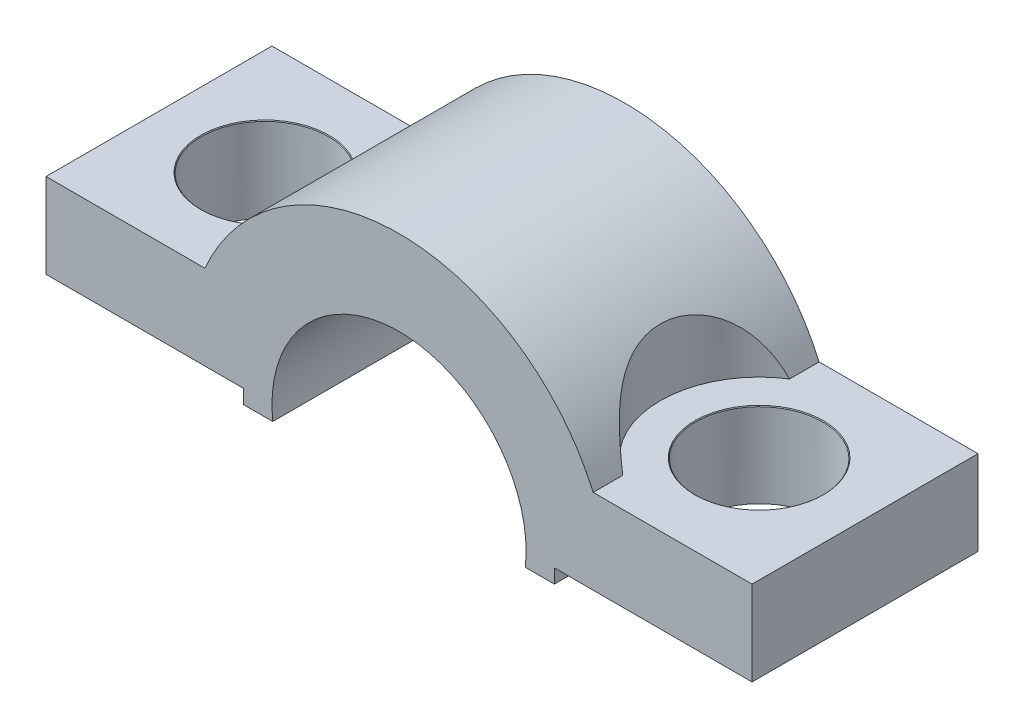
ISO-10303-21;
HEADER;
FILE_DESCRIPTION(('STEP AP214'),'2;1');
FILE_NAME('part.step','',(''),(''),'','','');
FILE_SCHEMA(('AUTOMOTIVE_DESIGN { 1 0 10303 214 1 1 1 1 }'));
ENDSEC;
DATA;
#1=APPLICATION_CONTEXT('core data for automotive mechanical design processes');
#2=APPLICATION_PROTOCOL_DEFINITION('international standard','automotive_design',2000,#1);
#3=PRODUCT_CONTEXT('',#1,'mechanical');
#4=PRODUCT('Part','Part','',(#3));
#5=PRODUCT_RELATED_PRODUCT_CATEGORY('part','',(#4));
#6=PRODUCT_DEFINITION_FORMATION('','',#4);
#7=PRODUCT_DEFINITION_CONTEXT('part definition',#1,'design');
#8=PRODUCT_DEFINITION('design','',#6,#7);
#9=PRODUCT_DEFINITION_SHAPE('','',#8);
#10=(LENGTH_UNIT() NAMED_UNIT(*) SI_UNIT(.MILLI.,.METRE.));
#11=(NAMED_UNIT(*) PLANE_ANGLE_UNIT() SI_UNIT($,.RADIAN.));
#12=(NAMED_UNIT(*) SI_UNIT($,.STERADIAN.) SOLID_ANGLE_UNIT());
#13=UNCERTAINTY_MEASURE_WITH_UNIT(LENGTH_MEASURE(1.E-05),#10,'distance_accuracy_value','');
#14=(GEOMETRIC_REPRESENTATION_CONTEXT(3) GLOBAL_UNCERTAINTY_ASSIGNED_CONTEXT((#13)) GLOBAL_UNIT_ASSIGNED_CONTEXT((#10,
#11,#12)) REPRESENTATION_CONTEXT('',''));
#15=CARTESIAN_POINT('',(0.,0.,0.));
#16=DIRECTION('',(0.,0.,1.));
#17=DIRECTION('',(1.,0.,0.));
#18=AXIS2_PLACEMENT_3D('',#15,#16,#17);
#19=CARTESIAN_POINT('',(0.,0.,8.));
#20=DIRECTION('',(0.,0.,-1.));
#21=DIRECTION('',(-1.,0.,0.));
#22=AXIS2_PLACEMENT_3D('',#19,#20,#21);
#23=CYLINDRICAL_SURFACE('',#22,7.5);
#24=DIRECTION('',(0.,0.,-1.));
#25=VECTOR('',#24,1.);
#26=CARTESIAN_POINT('',(6.87386354243376,3.,8.));
#27=LINE('',#26,#25);
#28=CARTESIAN_POINT('',(6.87386354243376,3.,8.));
#29=VERTEX_POINT('',#28);
#30=CARTESIAN_POINT('',(6.87386354243376,3.,6.95467629235265));
#31=VERTEX_POINT('',#30);
#32=EDGE_CURVE('E190',#29,#31,#27,.T.);
#33=ORIENTED_EDGE('',*,*,#32,.T.);
#34=CARTESIAN_POINT('',(6.87386354243376,3.,6.95467629235265));
#35=CARTESIAN_POINT('',(6.82725321535716,3.10686067237577,6.92505038627435));
#36=CARTESIAN_POINT('',(6.77838105926723,3.21198311139782,6.89249671722079));
#37=CARTESIAN_POINT('',(6.67675486093297,3.41819916637454,6.82056505245846));
#38=CARTESIAN_POINT('',(6.62399341148504,3.51928449829662,6.78117383070843));
#39=CARTESIAN_POINT('',(6.51495380665502,3.71729391693365,6.6943369873779));
#40=CARTESIAN_POINT('',(6.45864941165105,3.81417497055057,6.64682529901511));
#41=CARTESIAN_POINT('',(6.34408765908655,4.00182934661818,6.54313818713776));
#42=CARTESIAN_POINT('',(6.2858320030021,4.09260779290067,6.486970165446));
#43=CARTESIAN_POINT('',(6.14102854897093,4.30831628309082,6.33639427096159));
#44=CARTESIAN_POINT('',(6.05407564069189,4.42919915319211,6.23643414070272));
#45=CARTESIAN_POINT('',(5.88458599666926,4.65200992833673,6.01462649249154));
#46=CARTESIAN_POINT('',(5.80203528971963,4.75400069986742,5.89285431948707));
#47=CARTESIAN_POINT('',(5.68604335660596,4.89107261035333,5.69357490507859));
#48=CARTESIAN_POINT('',(5.64849608379264,4.93430861741121,5.62393794675249));
#49=CARTESIAN_POINT('',(5.5770887847886,5.01487448343902,5.47956245975678));
#50=CARTESIAN_POINT('',(5.54322686858753,5.05220737427364,5.40482657833545));
#51=CARTESIAN_POINT('',(5.48002846723094,5.12069004036265,5.25069193217783));
#52=CARTESIAN_POINT('',(5.45069439512257,5.15183652118027,5.17129071202518));
#53=CARTESIAN_POINT('',(5.39736004482914,5.20768638630462,5.00853044302546));
#54=CARTESIAN_POINT('',(5.37335882077416,5.23239091333491,4.92517209922884));
#55=CARTESIAN_POINT('',(5.33437233503921,5.27210870754067,4.76753013721272));
#56=CARTESIAN_POINT('',(5.31858697211988,5.28800462121963,4.69366468608141));
#57=CARTESIAN_POINT('',(5.2917278852645,5.31488265674953,4.5441715857556));
#58=CARTESIAN_POINT('',(5.280655760948,5.32586311041444,4.46854334746168));
#59=CARTESIAN_POINT('',(5.26347512551859,5.34284364750111,4.3162399908324));
#60=CARTESIAN_POINT('',(5.25736190785499,5.34884845347931,4.23956593555514));
#61=CARTESIAN_POINT('',(5.25020134522296,5.3558754793867,4.08574676069184));
#62=CARTESIAN_POINT('',(5.24915579617626,5.35689593292142,4.00860148380655));
#63=CARTESIAN_POINT('',(5.25345463812275,5.35269014975468,3.78976537880927));
#64=CARTESIAN_POINT('',(5.26489490616874,5.34150585901739,3.6482149217585));
#65=CARTESIAN_POINT('',(5.30430635911783,5.30236489485648,3.36993535206473));
#66=CARTESIAN_POINT('',(5.33227460729994,5.27441120103696,3.23320538748031));
#67=CARTESIAN_POINT('',(5.4027993291797,5.20214298177105,2.96796850693995));
#68=CARTESIAN_POINT('',(5.44536910811923,5.1578135315222,2.83946921814142));
#69=CARTESIAN_POINT('',(5.54221244249114,5.05360417920766,2.59374174788709));
#70=CARTESIAN_POINT('',(5.59648728196031,4.99372257093398,2.47651480504116));
#71=CARTESIAN_POINT('',(5.71725990036631,4.85509244041146,2.24776421228563));
#72=CARTESIAN_POINT('',(5.78433432702579,4.7753456808255,2.13715478283668));
#73=CARTESIAN_POINT('',(5.92370771772636,4.60131425092226,1.93178644231409));
#74=CARTESIAN_POINT('',(5.99601014593523,4.50701989332296,1.83703818153927));
#75=CARTESIAN_POINT('',(6.12225065078074,4.33316383741803,1.68660052914249));
#76=CARTESIAN_POINT('',(6.17588858789133,4.25647678739561,1.62726519046118));
#77=CARTESIAN_POINT('',(6.28265535420684,4.09724590584679,1.51642748621912));
#78=CARTESIAN_POINT('',(6.33578393458142,4.01469936235203,1.4649287828379));
#79=CARTESIAN_POINT('',(6.4405137994691,3.84444920757389,1.36916017269573));
#80=CARTESIAN_POINT('',(6.49211302349275,3.75673907549444,1.324899685037));
#81=CARTESIAN_POINT('',(6.5928596577692,3.57698371259997,1.24301657338099));
#82=CARTESIAN_POINT('',(6.64200795930431,3.48494008169388,1.20539152358208));
#83=CARTESIAN_POINT('',(6.72189916699377,3.3273377167529,1.14721136502048));
#84=CARTESIAN_POINT('',(6.75347796760898,3.26278129741034,1.12505801479295));
#85=CARTESIAN_POINT('',(6.81494045554786,3.13237479905454,1.08333889300346));
#86=CARTESIAN_POINT('',(6.8448302233025,3.06653068507293,1.06376345046689));
#87=CARTESIAN_POINT('',(6.87386354243376,3.,1.04532370764735));
#88=B_SPLINE_CURVE_WITH_KNOTS('',3,(#34,#35,#36,#37,#38,#39,#40,#41,#42,#43,#44,#45,#46,#47,#48,
#49,#50,#51,#52,#53,#54,#55,#56,#57,#58,#59,#60,#61,#62,#63,#64,#65,#66,#67,#68,#69,#70,#71,#72,
#73,#74,#75,#76,#77,#78,#79,#80,#81,#82,#83,#84,#85,#86,#87),.UNSPECIFIED.,.F.,.F.,(4,2,2,2,2,2,
2,2,2,2,2,2,2,2,2,2,2,2,2,2,2,2,2,2,2,2,4),(0.,0.360877312459293,0.722460619845825,
1.08713944566849,1.45150815600247,1.98745333890859,2.52158171629287,2.79170769579841,
3.06169448366291,3.33182466384087,3.60190689359255,3.8331623205748,4.06449617056346,
4.29561020140701,4.52680613034026,4.95193948851722,5.37699733094321,5.80244352911322,
6.22793642218932,6.68205377516062,7.13647484173996,7.46847379650935,7.80062742613474,
8.13320990642631,8.46567054711131,8.6912108152637,8.91587928489277),.UNSPECIFIED.);
#89=CARTESIAN_POINT('',(6.87386354243376,3.,1.04532370764735));
#90=VERTEX_POINT('',#89);
#91=EDGE_CURVE('E301',#31,#90,#88,.T.);
#92=ORIENTED_EDGE('',*,*,#91,.T.);
#93=CARTESIAN_POINT('',(6.87386354243376,3.,0.));
#94=VERTEX_POINT('',#93);
#95=EDGE_CURVE('E189',#90,#94,#27,.T.);
#96=ORIENTED_EDGE('',*,*,#95,.T.);
#97=CARTESIAN_POINT('',(0.,0.,0.));
#98=DIRECTION('',(0.,0.,1.));
#99=DIRECTION('',(1.,0.,0.));
#100=AXIS2_PLACEMENT_3D('',#97,#98,#99);
#101=CIRCLE('',#100,7.5);
#102=CARTESIAN_POINT('',(-6.87386354243376,3.,0.));
#103=VERTEX_POINT('',#102);
#104=EDGE_CURVE('E170',#94,#103,#101,.T.);
#105=ORIENTED_EDGE('',*,*,#104,.T.);
#106=DIRECTION('',(0.,0.,-1.));
#107=VECTOR('',#106,1.);
#108=CARTESIAN_POINT('',(-6.87386354243376,3.,8.));
#109=LINE('',#108,#107);
#110=CARTESIAN_POINT('',(-6.87386354243376,3.,1.04532370764735));
#111=VERTEX_POINT('',#110);
#112=EDGE_CURVE('E185',#111,#103,#109,.T.);
#113=ORIENTED_EDGE('',*,*,#112,.F.);
#114=CARTESIAN_POINT('',(-6.87386354243376,3.,6.95467629235265));
#115=CARTESIAN_POINT('',(-6.82725321535716,3.10686067237577,6.92505038627435));
#116=CARTESIAN_POINT('',(-6.77838105926723,3.21198311139782,6.89249671722079));
#117=CARTESIAN_POINT('',(-6.67675486093297,3.41819916637454,6.82056505245846));
#118=CARTESIAN_POINT('',(-6.62399341148504,3.51928449829662,6.78117383070843));
#119=CARTESIAN_POINT('',(-6.51495380665502,3.71729391693365,6.6943369873779));
#120=CARTESIAN_POINT('',(-6.45864941165105,3.81417497055057,6.64682529901511));
#121=CARTESIAN_POINT('',(-6.34408765908655,4.00182934661818,6.54313818713776));
#122=CARTESIAN_POINT('',(-6.2858320030021,4.09260779290067,6.486970165446));
#123=CARTESIAN_POINT('',(-6.14102854897093,4.30831628309082,6.33639427096159));
#124=CARTESIAN_POINT('',(-6.05407564069189,4.42919915319211,6.23643414070272));
#125=CARTESIAN_POINT('',(-5.88458599666926,4.65200992833673,6.01462649249154));
#126=CARTESIAN_POINT('',(-5.80203528971963,4.75400069986742,5.89285431948707));
#127=CARTESIAN_POINT('',(-5.68604335660596,4.89107261035333,5.69357490507859));
#128=CARTESIAN_POINT('',(-5.64849608379264,4.93430861741121,5.62393794675249));
#129=CARTESIAN_POINT('',(-5.5770887847886,5.01487448343902,5.47956245975678));
#130=CARTESIAN_POINT('',(-5.54322686858753,5.05220737427364,5.40482657833545));
#131=CARTESIAN_POINT('',(-5.48002846723094,5.12069004036265,5.25069193217783));
#132=CARTESIAN_POINT('',(-5.45069439512257,5.15183652118027,5.17129071202518));
#133=CARTESIAN_POINT('',(-5.39736004482914,5.20768638630462,5.00853044302546));
#134=CARTESIAN_POINT('',(-5.37335882077416,5.23239091333491,4.92517209922884));
#135=CARTESIAN_POINT('',(-5.33437233503921,5.27210870754067,4.76753013721272));
#136=CARTESIAN_POINT('',(-5.31858697211988,5.28800462121963,4.69366468608141));
#137=CARTESIAN_POINT('',(-5.2917278852645,5.31488265674953,4.5441715857556));
#138=CARTESIAN_POINT('',(-5.280655760948,5.32586311041444,4.46854334746168));
#139=CARTESIAN_POINT('',(-5.26347512551859,5.34284364750111,4.3162399908324));
#140=CARTESIAN_POINT('',(-5.25736190785499,5.34884845347931,4.23956593555514));
#141=CARTESIAN_POINT('',(-5.25020134522296,5.3558754793867,4.08574676069184));
#142=CARTESIAN_POINT('',(-5.24915579617626,5.35689593292142,4.00860148380655));
#143=CARTESIAN_POINT('',(-5.25345463812275,5.35269014975468,3.78976537880927));
#144=CARTESIAN_POINT('',(-5.26489490616874,5.34150585901739,3.6482149217585));
#145=CARTESIAN_POINT('',(-5.30430635911783,5.30236489485648,3.36993535206473));
#146=CARTESIAN_POINT('',(-5.33227460729994,5.27441120103696,3.23320538748031));
#147=CARTESIAN_POINT('',(-5.4027993291797,5.20214298177105,2.96796850693995));
#148=CARTESIAN_POINT('',(-5.44536910811923,5.1578135315222,2.83946921814142));
#149=CARTESIAN_POINT('',(-5.54221244249114,5.05360417920766,2.59374174788709));
#150=CARTESIAN_POINT('',(-5.59648728196031,4.99372257093398,2.47651480504116));
#151=CARTESIAN_POINT('',(-5.71725990036631,4.85509244041146,2.24776421228563));
#152=CARTESIAN_POINT('',(-5.78433432702579,4.7753456808255,2.13715478283668));
#153=CARTESIAN_POINT('',(-5.92370771772636,4.60131425092226,1.93178644231409));
#154=CARTESIAN_POINT('',(-5.99601014593523,4.50701989332296,1.83703818153927));
#155=CARTESIAN_POINT('',(-6.12225065078074,4.33316383741803,1.68660052914249));
#156=CARTESIAN_POINT('',(-6.17588858789133,4.25647678739561,1.62726519046118));
#157=CARTESIAN_POINT('',(-6.28265535420684,4.09724590584679,1.51642748621912));
#158=CARTESIAN_POINT('',(-6.33578393458142,4.01469936235203,1.4649287828379));
#159=CARTESIAN_POINT('',(-6.4405137994691,3.84444920757389,1.36916017269573));
#160=CARTESIAN_POINT('',(-6.49211302349275,3.75673907549444,1.324899685037));
#161=CARTESIAN_POINT('',(-6.5928596577692,3.57698371259997,1.24301657338099));
#162=CARTESIAN_POINT('',(-6.64200795930431,3.48494008169388,1.20539152358208));
#163=CARTESIAN_POINT('',(-6.72189916699377,3.3273377167529,1.14721136502048));
#164=CARTESIAN_POINT('',(-6.75347796760898,3.26278129741034,1.12505801479295));
#165=CARTESIAN_POINT('',(-6.81494045554786,3.13237479905454,1.08333889300346));
#166=CARTESIAN_POINT('',(-6.8448302233025,3.06653068507293,1.06376345046689));
#167=CARTESIAN_POINT('',(-6.87386354243376,3.,1.04532370764735));
#168=B_SPLINE_CURVE_WITH_KNOTS('',3,(#114,#115,#116,#117,#118,#119,#120,#121,#122,#123,#124,
#125,#126,#127,#128,#129,#130,#131,#132,#133,#134,#135,#136,#137,#138,#139,#140,#141,#142,#143,
#144,#145,#146,#147,#148,#149,#150,#151,#152,#153,#154,#155,#156,#157,#158,#159,#160,#161,#162,
#163,#164,#165,#166,#167),.UNSPECIFIED.,.F.,.F.,(4,2,2,2,2,2,2,2,2,2,2,2,2,2,2,2,2,2,2,2,2,2,2,
2,2,2,4),(0.,0.360877312459293,0.722460619845825,1.08713944566849,1.45150815600247,
1.98745333890859,2.52158171629287,2.79170769579841,3.06169448366291,3.33182466384087,
3.60190689359255,3.8331623205748,4.06449617056346,4.29561020140701,4.52680613034026,
4.95193948851722,5.37699733094321,5.80244352911322,6.22793642218932,6.68205377516062,
7.13647484173996,7.46847379650935,7.80062742613474,8.13320990642631,8.46567054711131,
8.6912108152637,8.91587928489277),.UNSPECIFIED.);
#169=CARTESIAN_POINT('',(-6.87386354243376,3.,6.95467629235265));
#170=VERTEX_POINT('',#169);
#171=EDGE_CURVE('E245',#170,#111,#168,.T.);
#172=ORIENTED_EDGE('',*,*,#171,.F.);
#173=CARTESIAN_POINT('',(-6.87386354243376,3.,8.));
#174=VERTEX_POINT('',#173);
#175=EDGE_CURVE('E186',#174,#170,#109,.T.);
#176=ORIENTED_EDGE('',*,*,#175,.F.);
#177=CARTESIAN_POINT('',(0.,0.,8.));
#178=DIRECTION('',(0.,0.,1.));
#179=DIRECTION('',(1.,0.,0.));
#180=AXIS2_PLACEMENT_3D('',#177,#178,#179);
#181=CIRCLE('',#180,7.5);
#182=EDGE_CURVE('E235',#29,#174,#181,.T.);
#183=ORIENTED_EDGE('',*,*,#182,.F.);
#184=EDGE_LOOP('',(#33,#92,#96,#105,#113,#172,#176,#183));
#185=FACE_BOUND('',#184,.T.);
#186=ADVANCED_FACE('F36',(#185),#23,.T.);
#187=CARTESIAN_POINT('',(4.0089400095287,-0.500000000000002,8.));
#188=DIRECTION('',(0.,1.,0.));
#189=DIRECTION('',(0.,0.,1.));
#190=AXIS2_PLACEMENT_3D('',#187,#188,#189);
#191=PLANE('',#190);
#192=DIRECTION('',(1.,0.,0.));
#193=VECTOR('',#192,1.);
#194=CARTESIAN_POINT('',(4.0089400095287,-0.500000000000002,8.));
#195=LINE('',#194,#193);
#196=CARTESIAN_POINT('',(4.47213595499958,-0.500000000000002,8.));
#197=VERTEX_POINT('',#196);
#198=CARTESIAN_POINT('',(5.5,-0.500000000000002,8.));
#199=VERTEX_POINT('',#198);
#200=EDGE_CURVE('E106',#197,#199,#195,.T.);
#201=ORIENTED_EDGE('',*,*,#200,.F.);
#202=DIRECTION('',(0.,0.,-1.));
#203=VECTOR('',#202,1.);
#204=CARTESIAN_POINT('',(4.47213595499958,-0.500000000000002,1.));
#205=LINE('',#204,#203);
#206=CARTESIAN_POINT('',(4.47213595499958,-0.500000000000002,0.));
#207=VERTEX_POINT('',#206);
#208=EDGE_CURVE('E220',#197,#207,#205,.T.);
#209=ORIENTED_EDGE('',*,*,#208,.T.);
#210=DIRECTION('',(1.,0.,0.));
#211=VECTOR('',#210,1.);
#212=CARTESIAN_POINT('',(4.0089400095287,-0.500000000000002,0.));
#213=LINE('',#212,#211);
#214=CARTESIAN_POINT('',(5.5,-0.500000000000002,0.));
#215=VERTEX_POINT('',#214);
#216=EDGE_CURVE('E158',#207,#215,#213,.T.);
#217=ORIENTED_EDGE('',*,*,#216,.T.);
#218=DIRECTION('',(0.,0.,-1.));
#219=VECTOR('',#218,1.);
#220=CARTESIAN_POINT('',(5.5,-0.500000000000002,8.));
#221=LINE('',#220,#219);
#222=EDGE_CURVE('E44',#199,#215,#221,.T.);
#223=ORIENTED_EDGE('',*,*,#222,.F.);
#224=EDGE_LOOP('',(#201,#209,#217,#223));
#225=FACE_BOUND('',#224,.T.);
#226=ADVANCED_FACE('F38',(#225),#191,.F.);
#227=CARTESIAN_POINT('',(5.5,0.,8.));
#228=DIRECTION('',(-1.,0.,0.));
#229=DIRECTION('',(0.,-1.,0.));
#230=AXIS2_PLACEMENT_3D('',#227,#228,#229);
#231=PLANE('',#230);
#232=DIRECTION('',(0.,1.,0.));
#233=VECTOR('',#232,1.);
#234=CARTESIAN_POINT('',(5.5,0.,0.));
#235=LINE('',#234,#233);
#236=CARTESIAN_POINT('',(5.5,0.,0.));
#237=VERTEX_POINT('',#236);
#238=EDGE_CURVE('E160',#215,#237,#235,.T.);
#239=ORIENTED_EDGE('',*,*,#238,.T.);
#240=DIRECTION('',(0.,0.,-1.));
#241=VECTOR('',#240,1.);
#242=CARTESIAN_POINT('',(5.5,0.,8.));
#243=LINE('',#242,#241);
#244=CARTESIAN_POINT('',(5.5,0.,8.));
#245=VERTEX_POINT('',#244);
#246=EDGE_CURVE('E199',#245,#237,#243,.T.);
#247=ORIENTED_EDGE('',*,*,#246,.F.);
#248=DIRECTION('',(0.,1.,0.));
#249=VECTOR('',#248,1.);
#250=CARTESIAN_POINT('',(5.5,0.,8.));
#251=LINE('',#250,#249);
#252=EDGE_CURVE('E227',#199,#245,#251,.T.);
#253=ORIENTED_EDGE('',*,*,#252,.F.);
#254=ORIENTED_EDGE('',*,*,#222,.T.);
#255=EDGE_LOOP('',(#239,#247,#253,#254));
#256=FACE_BOUND('',#255,.T.);
#257=ADVANCED_FACE('F284',(#256),#231,.F.);
#258=CARTESIAN_POINT('',(5.5,0.,8.));
#259=DIRECTION('',(0.,1.,0.));
#260=DIRECTION('',(-1.,0.,0.));
#261=AXIS2_PLACEMENT_3D('',#258,#259,#260);
#262=PLANE('',#261);
#263=CARTESIAN_POINT('',(8.75,0.,4.));
#264=DIRECTION('',(0.,1.,0.));
#265=DIRECTION('',(-1.,0.,0.));
#266=AXIS2_PLACEMENT_3D('',#263,#264,#265);
#267=CIRCLE('',#266,2.25);
#268=CARTESIAN_POINT('',(6.5,0.,4.));
#269=VERTEX_POINT('',#268);
#270=EDGE_CURVE('E161',#269,#269,#267,.T.);
#271=ORIENTED_EDGE('',*,*,#270,.T.);
#272=EDGE_LOOP('',(#271));
#273=FACE_BOUND('',#272,.T.);
#274=DIRECTION('',(1.,0.,0.));
#275=VECTOR('',#274,1.);
#276=CARTESIAN_POINT('',(5.5,0.,0.));
#277=LINE('',#276,#275);
#278=CARTESIAN_POINT('',(12.5,0.,0.));
#279=VERTEX_POINT('',#278);
#280=EDGE_CURVE('E163',#237,#279,#277,.T.);
#281=ORIENTED_EDGE('',*,*,#280,.T.);
#282=DIRECTION('',(0.,0.,-1.));
#283=VECTOR('',#282,1.);
#284=CARTESIAN_POINT('',(12.5,0.,8.));
#285=LINE('',#284,#283);
#286=CARTESIAN_POINT('',(12.5,0.,8.));
#287=VERTEX_POINT('',#286);
#288=EDGE_CURVE('E196',#287,#279,#285,.T.);
#289=ORIENTED_EDGE('',*,*,#288,.F.);
#290=DIRECTION('',(1.,0.,0.));
#291=VECTOR('',#290,1.);
#292=CARTESIAN_POINT('',(5.5,0.,8.));
#293=LINE('',#292,#291);
#294=EDGE_CURVE('E229',#245,#287,#293,.T.);
#295=ORIENTED_EDGE('',*,*,#294,.F.);
#296=ORIENTED_EDGE('',*,*,#246,.T.);
#297=EDGE_LOOP('',(#281,#289,#295,#296));
#298=FACE_BOUND('',#297,.T.);
#299=ADVANCED_FACE('F288',(#273,#298),#262,.F.);
#300=CARTESIAN_POINT('',(12.5,0.,8.));
#301=DIRECTION('',(-1.,0.,0.));
#302=DIRECTION('',(0.,0.,1.));
#303=AXIS2_PLACEMENT_3D('',#300,#301,#302);
#304=PLANE('',#303);
#305=DIRECTION('',(0.,1.,0.));
#306=VECTOR('',#305,1.);
#307=CARTESIAN_POINT('',(12.5,0.,0.));
#308=LINE('',#307,#306);
#309=CARTESIAN_POINT('',(12.5,3.,0.));
#310=VERTEX_POINT('',#309);
#311=EDGE_CURVE('E165',#279,#310,#308,.T.);
#312=ORIENTED_EDGE('',*,*,#311,.T.);
#313=DIRECTION('',(0.,0.,-1.));
#314=VECTOR('',#313,1.);
#315=CARTESIAN_POINT('',(12.5,3.,8.));
#316=LINE('',#315,#314);
#317=CARTESIAN_POINT('',(12.5,3.,8.));
#318=VERTEX_POINT('',#317);
#319=EDGE_CURVE('E193',#318,#310,#316,.T.);
#320=ORIENTED_EDGE('',*,*,#319,.F.);
#321=DIRECTION('',(0.,1.,0.));
#322=VECTOR('',#321,1.);
#323=CARTESIAN_POINT('',(12.5,0.,8.));
#324=LINE('',#323,#322);
#325=EDGE_CURVE('E231',#287,#318,#324,.T.);
#326=ORIENTED_EDGE('',*,*,#325,.F.);
#327=ORIENTED_EDGE('',*,*,#288,.T.);
#328=EDGE_LOOP('',(#312,#320,#326,#327));
#329=FACE_BOUND('',#328,.T.);
#330=ADVANCED_FACE('F293',(#329),#304,.F.);
#331=CARTESIAN_POINT('',(6.87386354243376,3.,8.));
#332=DIRECTION('',(0.,-1.,0.));
#333=DIRECTION('',(0.,0.,-1.));
#334=AXIS2_PLACEMENT_3D('',#331,#332,#333);
#335=PLANE('',#334);
#336=CARTESIAN_POINT('',(8.75,3.,4.));
#337=DIRECTION('',(0.,1.,0.));
#338=DIRECTION('',(0.,0.,1.));
#339=AXIS2_PLACEMENT_3D('',#336,#337,#338);
#340=CIRCLE('',#339,2.275);
#341=CARTESIAN_POINT('',(8.75,3.,6.275));
#342=VERTEX_POINT('',#341);
#343=EDGE_CURVE('E208',#342,#342,#340,.T.);
#344=ORIENTED_EDGE('',*,*,#343,.F.);
#345=EDGE_LOOP('',(#344));
#346=FACE_BOUND('',#345,.T.);
#347=ORIENTED_EDGE('',*,*,#95,.F.);
#348=CARTESIAN_POINT('',(8.75,3.,4.));
#349=DIRECTION('',(0.,-1.,0.));
#350=DIRECTION('',(0.,0.,1.));
#351=AXIS2_PLACEMENT_3D('',#348,#349,#350);
#352=CIRCLE('',#351,3.5);
#353=EDGE_CURVE('E299',#31,#90,#352,.T.);
#354=ORIENTED_EDGE('',*,*,#353,.F.);
#355=ORIENTED_EDGE('',*,*,#32,.F.);
#356=DIRECTION('',(-1.,0.,0.));
#357=VECTOR('',#356,1.);
#358=CARTESIAN_POINT('',(6.87386354243376,3.,8.));
#359=LINE('',#358,#357);
#360=EDGE_CURVE('E233',#318,#29,#359,.T.);
#361=ORIENTED_EDGE('',*,*,#360,.F.);
#362=ORIENTED_EDGE('',*,*,#319,.T.);
#363=DIRECTION('',(-1.,0.,0.));
#364=VECTOR('',#363,1.);
#365=CARTESIAN_POINT('',(6.87386354243376,3.,0.));
#366=LINE('',#365,#364);
#367=EDGE_CURVE('E167',#310,#94,#366,.T.);
#368=ORIENTED_EDGE('',*,*,#367,.T.);
#369=EDGE_LOOP('',(#347,#354,#355,#361,#362,#368));
#370=FACE_BOUND('',#369,.T.);
#371=ADVANCED_FACE('F297',(#346,#370),#335,.F.);
#372=CARTESIAN_POINT('',(-12.5,3.,8.));
#373=DIRECTION('',(0.,-1.,0.));
#374=DIRECTION('',(0.,0.,-1.));
#375=AXIS2_PLACEMENT_3D('',#372,#373,#374);
#376=PLANE('',#375);
#377=CARTESIAN_POINT('',(-8.75,3.,4.));
#378=DIRECTION('',(0.,1.,0.));
#379=DIRECTION('',(0.,0.,1.));
#380=AXIS2_PLACEMENT_3D('',#377,#378,#379);
#381=CIRCLE('',#380,3.5);
#382=EDGE_CURVE('E303',#170,#111,#381,.T.);
#383=ORIENTED_EDGE('',*,*,#382,.T.);
#384=ORIENTED_EDGE('',*,*,#112,.T.);
#385=DIRECTION('',(-1.,0.,0.));
#386=VECTOR('',#385,1.);
#387=CARTESIAN_POINT('',(-12.5,3.,0.));
#388=LINE('',#387,#386);
#389=CARTESIAN_POINT('',(-12.5,3.,0.));
#390=VERTEX_POINT('',#389);
#391=EDGE_CURVE('E173',#103,#390,#388,.T.);
#392=ORIENTED_EDGE('',*,*,#391,.T.);
#393=DIRECTION('',(0.,0.,-1.));
#394=VECTOR('',#393,1.);
#395=CARTESIAN_POINT('',(-12.5,3.,8.));
#396=LINE('',#395,#394);
#397=CARTESIAN_POINT('',(-12.5,3.,8.));
#398=VERTEX_POINT('',#397);
#399=EDGE_CURVE('E147',#398,#390,#396,.T.);
#400=ORIENTED_EDGE('',*,*,#399,.F.);
#401=DIRECTION('',(-1.,0.,0.));
#402=VECTOR('',#401,1.);
#403=CARTESIAN_POINT('',(-12.5,3.,8.));
#404=LINE('',#403,#402);
#405=EDGE_CURVE('E135',#174,#398,#404,.T.);
#406=ORIENTED_EDGE('',*,*,#405,.F.);
#407=ORIENTED_EDGE('',*,*,#175,.T.);
#408=EDGE_LOOP('',(#383,#384,#392,#400,#406,#407));
#409=FACE_BOUND('',#408,.T.);
#410=CARTESIAN_POINT('',(-8.75,3.,4.));
#411=DIRECTION('',(0.,1.,0.));
#412=DIRECTION('',(0.,0.,1.));
#413=AXIS2_PLACEMENT_3D('',#410,#411,#412);
#414=CIRCLE('',#413,2.275);
#415=CARTESIAN_POINT('',(-8.75,3.,6.275));
#416=VERTEX_POINT('',#415);
#417=EDGE_CURVE('E215',#416,#416,#414,.T.);
#418=ORIENTED_EDGE('',*,*,#417,.F.);
#419=EDGE_LOOP('',(#418));
#420=FACE_BOUND('',#419,.T.);
#421=ADVANCED_FACE('F248',(#409,#420),#376,.F.);
#422=CARTESIAN_POINT('',(-12.5,0.,8.));
#423=DIRECTION('',(1.,0.,0.));
#424=DIRECTION('',(0.,0.,-1.));
#425=AXIS2_PLACEMENT_3D('',#422,#423,#424);
#426=PLANE('',#425);
#427=DIRECTION('',(0.,-1.,0.));
#428=VECTOR('',#427,1.);
#429=CARTESIAN_POINT('',(-12.5,0.,0.));
#430=LINE('',#429,#428);
#431=CARTESIAN_POINT('',(-12.5,0.,0.));
#432=VERTEX_POINT('',#431);
#433=EDGE_CURVE('E144',#390,#432,#430,.T.);
#434=ORIENTED_EDGE('',*,*,#433,.T.);
#435=DIRECTION('',(0.,0.,-1.));
#436=VECTOR('',#435,1.);
#437=CARTESIAN_POINT('',(-12.5,0.,8.));
#438=LINE('',#437,#436);
#439=CARTESIAN_POINT('',(-12.5,0.,8.));
#440=VERTEX_POINT('',#439);
#441=EDGE_CURVE('E141',#440,#432,#438,.T.);
#442=ORIENTED_EDGE('',*,*,#441,.F.);
#443=DIRECTION('',(0.,-1.,0.));
#444=VECTOR('',#443,1.);
#445=CARTESIAN_POINT('',(-12.5,0.,8.));
#446=LINE('',#445,#444);
#447=EDGE_CURVE('E128',#398,#440,#446,.T.);
#448=ORIENTED_EDGE('',*,*,#447,.F.);
#449=ORIENTED_EDGE('',*,*,#399,.T.);
#450=EDGE_LOOP('',(#434,#442,#448,#449));
#451=FACE_BOUND('',#450,.T.);
#452=ADVANCED_FACE('F142',(#451),#426,.F.);
#453=CARTESIAN_POINT('',(-12.5,0.,8.));
#454=DIRECTION('',(0.,1.,0.));
#455=DIRECTION('',(-1.,0.,0.));
#456=AXIS2_PLACEMENT_3D('',#453,#454,#455);
#457=PLANE('',#456);
#458=CARTESIAN_POINT('',(-8.75,0.,4.));
#459=DIRECTION('',(0.,1.,0.));
#460=DIRECTION('',(-1.,0.,0.));
#461=AXIS2_PLACEMENT_3D('',#458,#459,#460);
#462=CIRCLE('',#461,2.25);
#463=CARTESIAN_POINT('',(-11.,0.,4.));
#464=VERTEX_POINT('',#463);
#465=EDGE_CURVE('E206',#464,#464,#462,.T.);
#466=ORIENTED_EDGE('',*,*,#465,.T.);
#467=EDGE_LOOP('',(#466));
#468=FACE_BOUND('',#467,.T.);
#469=DIRECTION('',(1.,0.,0.));
#470=VECTOR('',#469,1.);
#471=CARTESIAN_POINT('',(-12.5,0.,0.));
#472=LINE('',#471,#470);
#473=CARTESIAN_POINT('',(-5.5,0.,0.));
#474=VERTEX_POINT('',#473);
#475=EDGE_CURVE('E176',#432,#474,#472,.T.);
#476=ORIENTED_EDGE('',*,*,#475,.T.);
#477=DIRECTION('',(0.,0.,-1.));
#478=VECTOR('',#477,1.);
#479=CARTESIAN_POINT('',(-5.5,0.,8.));
#480=LINE('',#479,#478);
#481=CARTESIAN_POINT('',(-5.5,0.,8.));
#482=VERTEX_POINT('',#481);
#483=EDGE_CURVE('E148',#482,#474,#480,.T.);
#484=ORIENTED_EDGE('',*,*,#483,.F.);
#485=DIRECTION('',(1.,0.,0.));
#486=VECTOR('',#485,1.);
#487=CARTESIAN_POINT('',(-12.5,0.,8.));
#488=LINE('',#487,#486);
#489=EDGE_CURVE('E132',#440,#482,#488,.T.);
#490=ORIENTED_EDGE('',*,*,#489,.F.);
#491=ORIENTED_EDGE('',*,*,#441,.T.);
#492=EDGE_LOOP('',(#476,#484,#490,#491));
#493=FACE_BOUND('',#492,.T.);
#494=ADVANCED_FACE('F150',(#468,#493),#457,.F.);
#495=CARTESIAN_POINT('',(-5.5,0.,8.));
#496=DIRECTION('',(1.,0.,0.));
#497=DIRECTION('',(0.,1.,0.));
#498=AXIS2_PLACEMENT_3D('',#495,#496,#497);
#499=PLANE('',#498);
#500=DIRECTION('',(0.,-1.,0.));
#501=VECTOR('',#500,1.);
#502=CARTESIAN_POINT('',(-5.5,0.,0.));
#503=LINE('',#502,#501);
#504=CARTESIAN_POINT('',(-5.5,-0.500000000000002,0.));
#505=VERTEX_POINT('',#504);
#506=EDGE_CURVE('E98',#474,#505,#503,.T.);
#507=ORIENTED_EDGE('',*,*,#506,.T.);
#508=DIRECTION('',(0.,0.,-1.));
#509=VECTOR('',#508,1.);
#510=CARTESIAN_POINT('',(-5.5,-0.500000000000002,8.));
#511=LINE('',#510,#509);
#512=CARTESIAN_POINT('',(-5.5,-0.500000000000002,8.));
#513=VERTEX_POINT('',#512);
#514=EDGE_CURVE('E157',#513,#505,#511,.T.);
#515=ORIENTED_EDGE('',*,*,#514,.F.);
#516=DIRECTION('',(0.,-1.,0.));
#517=VECTOR('',#516,1.);
#518=CARTESIAN_POINT('',(-5.5,0.,8.));
#519=LINE('',#518,#517);
#520=EDGE_CURVE('E59',#482,#513,#519,.T.);
#521=ORIENTED_EDGE('',*,*,#520,.F.);
#522=ORIENTED_EDGE('',*,*,#483,.T.);
#523=EDGE_LOOP('',(#507,#515,#521,#522));
#524=FACE_BOUND('',#523,.T.);
#525=ADVANCED_FACE('F256',(#524),#499,.F.);
#526=CARTESIAN_POINT('',(-5.5,-0.500000000000002,8.));
#527=DIRECTION('',(0.,1.,0.));
#528=DIRECTION('',(0.,0.,1.));
#529=AXIS2_PLACEMENT_3D('',#526,#527,#528);
#530=PLANE('',#529);
#531=DIRECTION('',(0.,0.,-1.));
#532=VECTOR('',#531,1.);
#533=CARTESIAN_POINT('',(-4.47213595499958,-0.500000000000002,1.));
#534=LINE('',#533,#532);
#535=CARTESIAN_POINT('',(-4.47213595499958,-0.500000000000002,0.));
#536=VERTEX_POINT('',#535);
#537=CARTESIAN_POINT('',(-4.47213595499958,-0.500000000000002,8.));
#538=VERTEX_POINT('',#537);
#539=EDGE_CURVE('E51',#536,#538,#534,.F.);
#540=ORIENTED_EDGE('',*,*,#539,.T.);
#541=DIRECTION('',(1.,0.,0.));
#542=VECTOR('',#541,1.);
#543=CARTESIAN_POINT('',(-5.5,-0.500000000000002,8.));
#544=LINE('',#543,#542);
#545=EDGE_CURVE('E152',#513,#538,#544,.T.);
#546=ORIENTED_EDGE('',*,*,#545,.F.);
#547=ORIENTED_EDGE('',*,*,#514,.T.);
#548=DIRECTION('',(1.,0.,0.));
#549=VECTOR('',#548,1.);
#550=CARTESIAN_POINT('',(-5.5,-0.500000000000002,0.));
#551=LINE('',#550,#549);
#552=EDGE_CURVE('E179',#505,#536,#551,.T.);
#553=ORIENTED_EDGE('',*,*,#552,.T.);
#554=EDGE_LOOP('',(#540,#546,#547,#553));
#555=FACE_BOUND('',#554,.T.);
#556=ADVANCED_FACE('F259',(#555),#530,.F.);
#557=CARTESIAN_POINT('',(0.,0.,8.));
#558=DIRECTION('',(0.,0.,1.));
#559=DIRECTION('',(1.,0.,0.));
#560=AXIS2_PLACEMENT_3D('',#557,#558,#559);
#561=PLANE('',#560);
#562=CARTESIAN_POINT('',(0.,0.,8.));
#563=DIRECTION('',(0.,0.,-1.));
#564=DIRECTION('',(-1.,0.,0.));
#565=AXIS2_PLACEMENT_3D('',#562,#563,#564);
#566=CIRCLE('',#565,4.5);
#567=EDGE_CURVE('E262',#538,#197,#566,.T.);
#568=ORIENTED_EDGE('',*,*,#567,.T.);
#569=ORIENTED_EDGE('',*,*,#200,.T.);
#570=ORIENTED_EDGE('',*,*,#252,.T.);
#571=ORIENTED_EDGE('',*,*,#294,.T.);
#572=ORIENTED_EDGE('',*,*,#325,.T.);
#573=ORIENTED_EDGE('',*,*,#360,.T.);
#574=ORIENTED_EDGE('',*,*,#182,.T.);
#575=ORIENTED_EDGE('',*,*,#405,.T.);
#576=ORIENTED_EDGE('',*,*,#447,.T.);
#577=ORIENTED_EDGE('',*,*,#489,.T.);
#578=ORIENTED_EDGE('',*,*,#520,.T.);
#579=ORIENTED_EDGE('',*,*,#545,.T.);
#580=EDGE_LOOP('',(#568,#569,#570,#571,#572,#573,#574,#575,#576,#577,#578,#579));
#581=FACE_BOUND('',#580,.T.);
#582=ADVANCED_FACE('F130',(#581),#561,.T.);
#583=CARTESIAN_POINT('',(0.,0.,0.));
#584=DIRECTION('',(0.,0.,1.));
#585=DIRECTION('',(1.,0.,0.));
#586=AXIS2_PLACEMENT_3D('',#583,#584,#585);
#587=PLANE('',#586);
#588=ORIENTED_EDGE('',*,*,#216,.F.);
#589=CARTESIAN_POINT('',(0.,0.,0.));
#590=DIRECTION('',(0.,0.,1.));
#591=DIRECTION('',(1.,0.,0.));
#592=AXIS2_PLACEMENT_3D('',#589,#590,#591);
#593=CIRCLE('',#592,4.5);
#594=EDGE_CURVE('E11',#207,#536,#593,.T.);
#595=ORIENTED_EDGE('',*,*,#594,.T.);
#596=ORIENTED_EDGE('',*,*,#552,.F.);
#597=ORIENTED_EDGE('',*,*,#506,.F.);
#598=ORIENTED_EDGE('',*,*,#475,.F.);
#599=ORIENTED_EDGE('',*,*,#433,.F.);
#600=ORIENTED_EDGE('',*,*,#391,.F.);
#601=ORIENTED_EDGE('',*,*,#104,.F.);
#602=ORIENTED_EDGE('',*,*,#367,.F.);
#603=ORIENTED_EDGE('',*,*,#311,.F.);
#604=ORIENTED_EDGE('',*,*,#280,.F.);
#605=ORIENTED_EDGE('',*,*,#238,.F.);
#606=EDGE_LOOP('',(#588,#595,#596,#597,#598,#599,#600,#601,#602,#603,#604,#605));
#607=FACE_BOUND('',#606,.T.);
#608=ADVANCED_FACE('F253',(#607),#587,.F.);
#609=CARTESIAN_POINT('',(8.75,3.,4.));
#610=DIRECTION('',(0.,1.,0.));
#611=DIRECTION('',(0.,0.,1.));
#612=AXIS2_PLACEMENT_3D('',#609,#610,#611);
#613=CYLINDRICAL_SURFACE('',#612,2.25);
#614=CARTESIAN_POINT('',(8.75,2.975,4.));
#615=DIRECTION('',(0.,1.,0.));
#616=DIRECTION('',(0.,0.,1.));
#617=AXIS2_PLACEMENT_3D('',#614,#615,#616);
#618=CIRCLE('',#617,2.25);
#619=CARTESIAN_POINT('',(8.75,2.975,6.25));
#620=VERTEX_POINT('',#619);
#621=EDGE_CURVE('E205',#620,#620,#618,.T.);
#622=ORIENTED_EDGE('',*,*,#621,.T.);
#623=EDGE_LOOP('',(#622));
#624=FACE_BOUND('',#623,.T.);
#625=ORIENTED_EDGE('',*,*,#270,.F.);
#626=EDGE_LOOP('',(#625));
#627=FACE_BOUND('',#626,.T.);
#628=ADVANCED_FACE('F341',(#624,#627),#613,.F.);
#629=CARTESIAN_POINT('',(8.75,3.,4.));
#630=DIRECTION('',(0.,1.,0.));
#631=DIRECTION('',(0.,0.,1.));
#632=AXIS2_PLACEMENT_3D('',#629,#630,#631);
#633=CONICAL_SURFACE('',#632,2.275,0.785398163397431);
#634=ORIENTED_EDGE('',*,*,#621,.F.);
#635=EDGE_LOOP('',(#634));
#636=FACE_BOUND('',#635,.T.);
#637=ORIENTED_EDGE('',*,*,#343,.T.);
#638=EDGE_LOOP('',(#637));
#639=FACE_BOUND('',#638,.T.);
#640=ADVANCED_FACE('F338',(#636,#639),#633,.F.);
#641=CARTESIAN_POINT('',(-8.75,3.,4.));
#642=DIRECTION('',(0.,1.,0.));
#643=DIRECTION('',(0.,0.,1.));
#644=AXIS2_PLACEMENT_3D('',#641,#642,#643);
#645=CYLINDRICAL_SURFACE('',#644,2.25);
#646=CARTESIAN_POINT('',(-8.75,2.975,4.));
#647=DIRECTION('',(0.,1.,0.));
#648=DIRECTION('',(0.,0.,1.));
#649=AXIS2_PLACEMENT_3D('',#646,#647,#648);
#650=CIRCLE('',#649,2.25);
#651=CARTESIAN_POINT('',(-8.75,2.975,6.25));
#652=VERTEX_POINT('',#651);
#653=EDGE_CURVE('E209',#652,#652,#650,.T.);
#654=ORIENTED_EDGE('',*,*,#653,.T.);
#655=EDGE_LOOP('',(#654));
#656=FACE_BOUND('',#655,.T.);
#657=ORIENTED_EDGE('',*,*,#465,.F.);
#658=EDGE_LOOP('',(#657));
#659=FACE_BOUND('',#658,.T.);
#660=ADVANCED_FACE('F334',(#656,#659),#645,.F.);
#661=CARTESIAN_POINT('',(-8.75,3.,4.));
#662=DIRECTION('',(0.,1.,0.));
#663=DIRECTION('',(0.,0.,1.));
#664=AXIS2_PLACEMENT_3D('',#661,#662,#663);
#665=CONICAL_SURFACE('',#664,2.275,0.785398163397448);
#666=ORIENTED_EDGE('',*,*,#653,.F.);
#667=EDGE_LOOP('',(#666));
#668=FACE_BOUND('',#667,.T.);
#669=ORIENTED_EDGE('',*,*,#417,.T.);
#670=EDGE_LOOP('',(#669));
#671=FACE_BOUND('',#670,.T.);
#672=ADVANCED_FACE('F331',(#668,#671),#665,.F.);
#673=CARTESIAN_POINT('',(0.,0.,1.));
#674=DIRECTION('',(0.,0.,-1.));
#675=DIRECTION('',(-1.,0.,0.));
#676=AXIS2_PLACEMENT_3D('',#673,#674,#675);
#677=CYLINDRICAL_SURFACE('',#676,4.5);
#678=ORIENTED_EDGE('',*,*,#208,.F.);
#679=ORIENTED_EDGE('',*,*,#567,.F.);
#680=ORIENTED_EDGE('',*,*,#539,.F.);
#681=ORIENTED_EDGE('',*,*,#594,.F.);
#682=EDGE_LOOP('',(#678,#679,#680,#681));
#683=FACE_BOUND('',#682,.T.);
#684=ADVANCED_FACE('F277',(#683),#677,.F.);
#685=CARTESIAN_POINT('',(-8.75,13.,4.));
#686=DIRECTION('',(0.,-1.,0.));
#687=DIRECTION('',(0.,0.,-1.));
#688=AXIS2_PLACEMENT_3D('',#685,#686,#687);
#689=CYLINDRICAL_SURFACE('',#688,3.5);
#690=ORIENTED_EDGE('',*,*,#171,.T.);
#691=ORIENTED_EDGE('',*,*,#382,.F.);
#692=EDGE_LOOP('',(#690,#691));
#693=FACE_BOUND('',#692,.T.);
#694=ADVANCED_FACE('F323',(#693),#689,.F.);
#695=CARTESIAN_POINT('',(8.75,13.,4.));
#696=DIRECTION('',(0.,-1.,0.));
#697=DIRECTION('',(0.,0.,-1.));
#698=AXIS2_PLACEMENT_3D('',#695,#696,#697);
#699=CYLINDRICAL_SURFACE('',#698,3.5);
#700=ORIENTED_EDGE('',*,*,#353,.T.);
#701=ORIENTED_EDGE('',*,*,#91,.F.);
#702=EDGE_LOOP('',(#700,#701));
#703=FACE_BOUND('',#702,.T.);
#704=ADVANCED_FACE('F327',(#703),#699,.F.);
#705=CLOSED_SHELL('',(#186,#226,#257,#299,#330,#371,#421,#452,#494,#525,#556,#582,#608,#628,
#640,#660,#672,#684,#694,#704));
#706=MANIFOLD_SOLID_BREP('B2',#705);
#707=ADVANCED_BREP_SHAPE_REPRESENTATION('',(#18,#706),#14);
#708=SHAPE_DEFINITION_REPRESENTATION(#9,#707);
ENDSEC;
END-ISO-10303-21;
